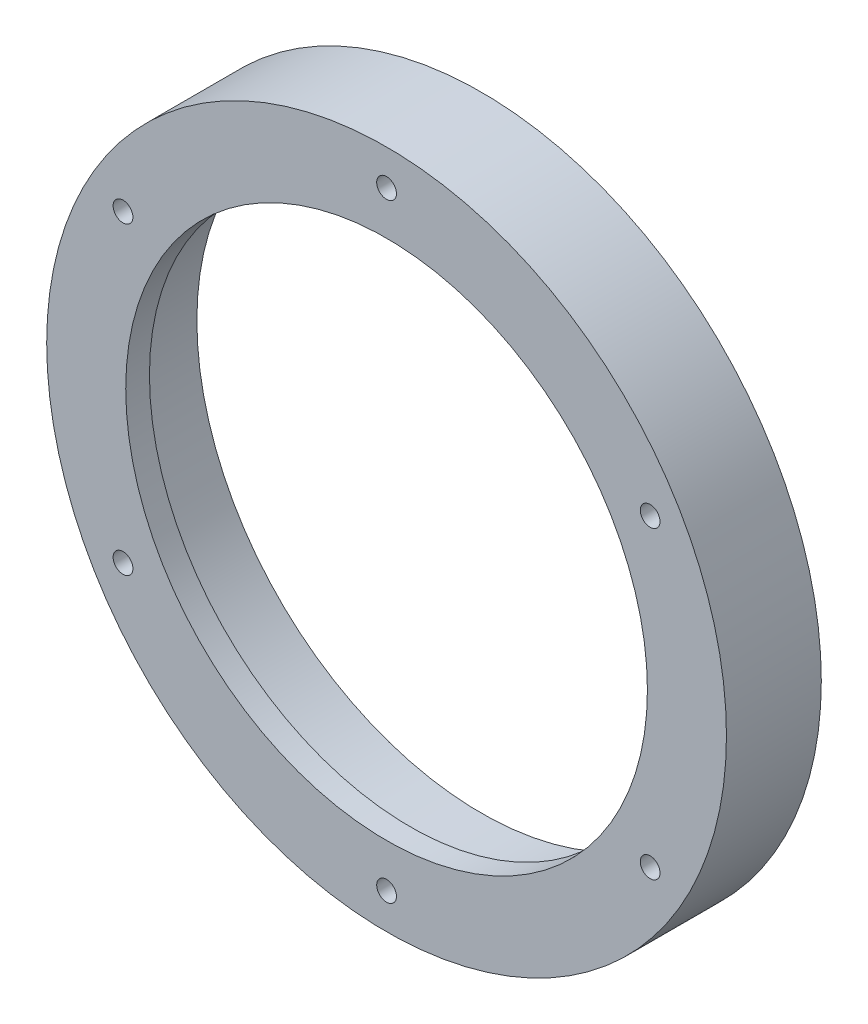
ISO-10303-21;
HEADER;
FILE_DESCRIPTION(('STEP AP214'),'2;1');
FILE_NAME('part.step','',(''),(''),'','','');
FILE_SCHEMA(('AUTOMOTIVE_DESIGN { 1 0 10303 214 1 1 1 1 }'));
ENDSEC;
DATA;
#1=APPLICATION_CONTEXT('core data for automotive mechanical design processes');
#2=APPLICATION_PROTOCOL_DEFINITION('international standard','automotive_design',2000,#1);
#3=PRODUCT_CONTEXT('',#1,'mechanical');
#4=PRODUCT('Part','Part','',(#3));
#5=PRODUCT_RELATED_PRODUCT_CATEGORY('part','',(#4));
#6=PRODUCT_DEFINITION_FORMATION('','',#4);
#7=PRODUCT_DEFINITION_CONTEXT('part definition',#1,'design');
#8=PRODUCT_DEFINITION('design','',#6,#7);
#9=PRODUCT_DEFINITION_SHAPE('','',#8);
#10=(LENGTH_UNIT() NAMED_UNIT(*) SI_UNIT(.MILLI.,.METRE.));
#11=(NAMED_UNIT(*) PLANE_ANGLE_UNIT() SI_UNIT($,.RADIAN.));
#12=(NAMED_UNIT(*) SI_UNIT($,.STERADIAN.) SOLID_ANGLE_UNIT());
#13=UNCERTAINTY_MEASURE_WITH_UNIT(LENGTH_MEASURE(1.E-05),#10,'distance_accuracy_value','');
#14=(GEOMETRIC_REPRESENTATION_CONTEXT(3) GLOBAL_UNCERTAINTY_ASSIGNED_CONTEXT((#13)) GLOBAL_UNIT_ASSIGNED_CONTEXT((#10,
#11,#12)) REPRESENTATION_CONTEXT('',''));
#15=CARTESIAN_POINT('',(0.,0.,0.));
#16=DIRECTION('',(0.,0.,1.));
#17=DIRECTION('',(1.,0.,0.));
#18=AXIS2_PLACEMENT_3D('',#15,#16,#17);
#19=CARTESIAN_POINT('',(0.,0.,0.));
#20=DIRECTION('',(0.,0.,1.));
#21=DIRECTION('',(1.,0.,0.));
#22=AXIS2_PLACEMENT_3D('',#19,#20,#21);
#23=PLANE('',#22);
#24=CARTESIAN_POINT('',(-33.3419780457009,19.25,0.));
#25=DIRECTION('',(0.,0.,-1.));
#26=DIRECTION('',(-1.,0.,0.));
#27=AXIS2_PLACEMENT_3D('',#24,#25,#26);
#28=CIRCLE('',#27,1.24999999999999);
#29=CARTESIAN_POINT('',(-34.5919780457009,19.25,0.));
#30=VERTEX_POINT('',#29);
#31=EDGE_CURVE('E97',#30,#30,#28,.T.);
#32=ORIENTED_EDGE('',*,*,#31,.F.);
#33=EDGE_LOOP('',(#32));
#34=FACE_BOUND('',#33,.T.);
#35=CARTESIAN_POINT('',(0.,38.5,0.));
#36=DIRECTION('',(0.,0.,-1.));
#37=DIRECTION('',(-1.,0.,0.));
#38=AXIS2_PLACEMENT_3D('',#35,#36,#37);
#39=CIRCLE('',#38,1.25);
#40=CARTESIAN_POINT('',(-1.25,38.5,0.));
#41=VERTEX_POINT('',#40);
#42=EDGE_CURVE('E91',#41,#41,#39,.T.);
#43=ORIENTED_EDGE('',*,*,#42,.F.);
#44=EDGE_LOOP('',(#43));
#45=FACE_BOUND('',#44,.T.);
#46=CARTESIAN_POINT('',(33.3419780457009,19.25,0.));
#47=DIRECTION('',(0.,0.,-1.));
#48=DIRECTION('',(-1.,0.,0.));
#49=AXIS2_PLACEMENT_3D('',#46,#47,#48);
#50=CIRCLE('',#49,1.24999999999999);
#51=CARTESIAN_POINT('',(32.0919780457009,19.25,0.));
#52=VERTEX_POINT('',#51);
#53=EDGE_CURVE('E85',#52,#52,#50,.T.);
#54=ORIENTED_EDGE('',*,*,#53,.F.);
#55=EDGE_LOOP('',(#54));
#56=FACE_BOUND('',#55,.T.);
#57=CARTESIAN_POINT('',(33.3419780457009,-19.25,0.));
#58=DIRECTION('',(0.,0.,-1.));
#59=DIRECTION('',(-1.,0.,0.));
#60=AXIS2_PLACEMENT_3D('',#57,#58,#59);
#61=CIRCLE('',#60,1.24999999999999);
#62=CARTESIAN_POINT('',(32.0919780457009,-19.25,0.));
#63=VERTEX_POINT('',#62);
#64=EDGE_CURVE('E79',#63,#63,#61,.T.);
#65=ORIENTED_EDGE('',*,*,#64,.F.);
#66=EDGE_LOOP('',(#65));
#67=FACE_BOUND('',#66,.T.);
#68=CARTESIAN_POINT('',(0.,-38.5,0.));
#69=DIRECTION('',(0.,0.,-1.));
#70=DIRECTION('',(-1.,0.,0.));
#71=AXIS2_PLACEMENT_3D('',#68,#69,#70);
#72=CIRCLE('',#71,1.25);
#73=CARTESIAN_POINT('',(-1.25,-38.5,0.));
#74=VERTEX_POINT('',#73);
#75=EDGE_CURVE('E73',#74,#74,#72,.T.);
#76=ORIENTED_EDGE('',*,*,#75,.F.);
#77=EDGE_LOOP('',(#76));
#78=FACE_BOUND('',#77,.T.);
#79=CARTESIAN_POINT('',(-33.3419780457009,-19.25,0.));
#80=DIRECTION('',(0.,0.,-1.));
#81=DIRECTION('',(-1.,0.,0.));
#82=AXIS2_PLACEMENT_3D('',#79,#80,#81);
#83=CIRCLE('',#82,1.24999999999999);
#84=CARTESIAN_POINT('',(-34.5919780457009,-19.25,0.));
#85=VERTEX_POINT('',#84);
#86=EDGE_CURVE('E67',#85,#85,#83,.T.);
#87=ORIENTED_EDGE('',*,*,#86,.F.);
#88=EDGE_LOOP('',(#87));
#89=FACE_BOUND('',#88,.T.);
#90=CARTESIAN_POINT('',(0.,0.,0.));
#91=DIRECTION('',(0.,0.,1.));
#92=DIRECTION('',(1.,0.,0.));
#93=AXIS2_PLACEMENT_3D('',#90,#91,#92);
#94=CIRCLE('',#93,43.);
#95=CARTESIAN_POINT('',(43.,0.,0.));
#96=VERTEX_POINT('',#95);
#97=EDGE_CURVE('E10',#96,#96,#94,.T.);
#98=ORIENTED_EDGE('',*,*,#97,.F.);
#99=EDGE_LOOP('',(#98));
#100=FACE_BOUND('',#99,.T.);
#101=CARTESIAN_POINT('',(0.,0.,0.));
#102=DIRECTION('',(0.,0.,1.));
#103=DIRECTION('',(1.,0.,0.));
#104=AXIS2_PLACEMENT_3D('',#101,#102,#103);
#105=CIRCLE('',#104,36.);
#106=CARTESIAN_POINT('',(36.,0.,0.));
#107=VERTEX_POINT('',#106);
#108=EDGE_CURVE('E45',#107,#107,#105,.T.);
#109=ORIENTED_EDGE('',*,*,#108,.T.);
#110=EDGE_LOOP('',(#109));
#111=FACE_BOUND('',#110,.T.);
#112=ADVANCED_FACE('F38',(#34,#45,#56,#67,#78,#89,#100,#111),#23,.F.);
#113=CARTESIAN_POINT('',(0.,0.,9.));
#114=DIRECTION('',(0.,0.,-1.));
#115=DIRECTION('',(-1.,0.,0.));
#116=AXIS2_PLACEMENT_3D('',#113,#114,#115);
#117=CYLINDRICAL_SURFACE('',#116,43.);
#118=ORIENTED_EDGE('',*,*,#97,.T.);
#119=EDGE_LOOP('',(#118));
#120=FACE_BOUND('',#119,.T.);
#121=CARTESIAN_POINT('',(0.,0.,12.));
#122=DIRECTION('',(0.,0.,1.));
#123=DIRECTION('',(1.,0.,0.));
#124=AXIS2_PLACEMENT_3D('',#121,#122,#123);
#125=CIRCLE('',#124,43.);
#126=CARTESIAN_POINT('',(43.,0.,12.));
#127=VERTEX_POINT('',#126);
#128=EDGE_CURVE('E53',#127,#127,#125,.T.);
#129=ORIENTED_EDGE('',*,*,#128,.F.);
#130=EDGE_LOOP('',(#129));
#131=FACE_BOUND('',#130,.T.);
#132=ADVANCED_FACE('F40',(#120,#131),#117,.T.);
#133=CARTESIAN_POINT('',(0.,0.,9.));
#134=DIRECTION('',(0.,0.,-1.));
#135=DIRECTION('',(-1.,0.,0.));
#136=AXIS2_PLACEMENT_3D('',#133,#134,#135);
#137=CYLINDRICAL_SURFACE('',#136,36.);
#138=CARTESIAN_POINT('',(0.,0.,9.));
#139=DIRECTION('',(0.,0.,1.));
#140=DIRECTION('',(1.,0.,0.));
#141=AXIS2_PLACEMENT_3D('',#138,#139,#140);
#142=CIRCLE('',#141,36.);
#143=CARTESIAN_POINT('',(36.,0.,9.));
#144=VERTEX_POINT('',#143);
#145=EDGE_CURVE('E49',#144,#144,#142,.T.);
#146=ORIENTED_EDGE('',*,*,#145,.T.);
#147=EDGE_LOOP('',(#146));
#148=FACE_BOUND('',#147,.T.);
#149=ORIENTED_EDGE('',*,*,#108,.F.);
#150=EDGE_LOOP('',(#149));
#151=FACE_BOUND('',#150,.T.);
#152=ADVANCED_FACE('F141',(#148,#151),#137,.F.);
#153=CARTESIAN_POINT('',(0.,0.,9.));
#154=DIRECTION('',(0.,0.,1.));
#155=DIRECTION('',(1.,0.,0.));
#156=AXIS2_PLACEMENT_3D('',#153,#154,#155);
#157=PLANE('',#156);
#158=CARTESIAN_POINT('',(0.,0.,9.));
#159=DIRECTION('',(0.,0.,1.));
#160=DIRECTION('',(1.,0.,0.));
#161=AXIS2_PLACEMENT_3D('',#158,#159,#160);
#162=CIRCLE('',#161,33.);
#163=CARTESIAN_POINT('',(33.,0.,9.));
#164=VERTEX_POINT('',#163);
#165=EDGE_CURVE('E59',#164,#164,#162,.T.);
#166=ORIENTED_EDGE('',*,*,#165,.T.);
#167=EDGE_LOOP('',(#166));
#168=FACE_BOUND('',#167,.T.);
#169=ORIENTED_EDGE('',*,*,#145,.F.);
#170=EDGE_LOOP('',(#169));
#171=FACE_BOUND('',#170,.T.);
#172=ADVANCED_FACE('F137',(#168,#171),#157,.F.);
#173=CARTESIAN_POINT('',(0.,0.,12.));
#174=DIRECTION('',(0.,0.,1.));
#175=DIRECTION('',(1.,0.,0.));
#176=AXIS2_PLACEMENT_3D('',#173,#174,#175);
#177=PLANE('',#176);
#178=CARTESIAN_POINT('',(-33.3419780457009,19.25,12.));
#179=DIRECTION('',(0.,0.,-1.));
#180=DIRECTION('',(-1.,0.,0.));
#181=AXIS2_PLACEMENT_3D('',#178,#179,#180);
#182=CIRCLE('',#181,1.24999999999999);
#183=CARTESIAN_POINT('',(-34.5919780457009,19.25,12.));
#184=VERTEX_POINT('',#183);
#185=EDGE_CURVE('E94',#184,#184,#182,.T.);
#186=ORIENTED_EDGE('',*,*,#185,.T.);
#187=EDGE_LOOP('',(#186));
#188=FACE_BOUND('',#187,.T.);
#189=CARTESIAN_POINT('',(0.,38.5,12.));
#190=DIRECTION('',(0.,0.,-1.));
#191=DIRECTION('',(-1.,0.,0.));
#192=AXIS2_PLACEMENT_3D('',#189,#190,#191);
#193=CIRCLE('',#192,1.24999999999999);
#194=CARTESIAN_POINT('',(-1.24999999999999,38.5,12.));
#195=VERTEX_POINT('',#194);
#196=EDGE_CURVE('E88',#195,#195,#193,.T.);
#197=ORIENTED_EDGE('',*,*,#196,.T.);
#198=EDGE_LOOP('',(#197));
#199=FACE_BOUND('',#198,.T.);
#200=CARTESIAN_POINT('',(33.3419780457009,19.25,12.));
#201=DIRECTION('',(0.,0.,-1.));
#202=DIRECTION('',(-1.,0.,0.));
#203=AXIS2_PLACEMENT_3D('',#200,#201,#202);
#204=CIRCLE('',#203,1.24999999999999);
#205=CARTESIAN_POINT('',(32.0919780457009,19.25,12.));
#206=VERTEX_POINT('',#205);
#207=EDGE_CURVE('E82',#206,#206,#204,.T.);
#208=ORIENTED_EDGE('',*,*,#207,.T.);
#209=EDGE_LOOP('',(#208));
#210=FACE_BOUND('',#209,.T.);
#211=CARTESIAN_POINT('',(33.3419780457009,-19.25,12.));
#212=DIRECTION('',(0.,0.,-1.));
#213=DIRECTION('',(-1.,0.,0.));
#214=AXIS2_PLACEMENT_3D('',#211,#212,#213);
#215=CIRCLE('',#214,1.24999999999999);
#216=CARTESIAN_POINT('',(32.0919780457009,-19.25,12.));
#217=VERTEX_POINT('',#216);
#218=EDGE_CURVE('E76',#217,#217,#215,.T.);
#219=ORIENTED_EDGE('',*,*,#218,.T.);
#220=EDGE_LOOP('',(#219));
#221=FACE_BOUND('',#220,.T.);
#222=CARTESIAN_POINT('',(0.,-38.5,12.));
#223=DIRECTION('',(0.,0.,-1.));
#224=DIRECTION('',(-1.,0.,0.));
#225=AXIS2_PLACEMENT_3D('',#222,#223,#224);
#226=CIRCLE('',#225,1.24999999999999);
#227=CARTESIAN_POINT('',(-1.25,-38.5,12.));
#228=VERTEX_POINT('',#227);
#229=EDGE_CURVE('E70',#228,#228,#226,.T.);
#230=ORIENTED_EDGE('',*,*,#229,.T.);
#231=EDGE_LOOP('',(#230));
#232=FACE_BOUND('',#231,.T.);
#233=CARTESIAN_POINT('',(-33.3419780457009,-19.25,12.));
#234=DIRECTION('',(0.,0.,-1.));
#235=DIRECTION('',(-1.,0.,0.));
#236=AXIS2_PLACEMENT_3D('',#233,#234,#235);
#237=CIRCLE('',#236,1.24999999999999);
#238=CARTESIAN_POINT('',(-34.5919780457009,-19.25,12.));
#239=VERTEX_POINT('',#238);
#240=EDGE_CURVE('E62',#239,#239,#237,.T.);
#241=ORIENTED_EDGE('',*,*,#240,.T.);
#242=EDGE_LOOP('',(#241));
#243=FACE_BOUND('',#242,.T.);
#244=ORIENTED_EDGE('',*,*,#128,.T.);
#245=EDGE_LOOP('',(#244));
#246=FACE_BOUND('',#245,.T.);
#247=CARTESIAN_POINT('',(0.,0.,12.));
#248=DIRECTION('',(0.,0.,1.));
#249=DIRECTION('',(1.,0.,0.));
#250=AXIS2_PLACEMENT_3D('',#247,#248,#249);
#251=CIRCLE('',#250,33.);
#252=CARTESIAN_POINT('',(33.,0.,12.));
#253=VERTEX_POINT('',#252);
#254=EDGE_CURVE('E58',#253,#253,#251,.T.);
#255=ORIENTED_EDGE('',*,*,#254,.F.);
#256=EDGE_LOOP('',(#255));
#257=FACE_BOUND('',#256,.T.);
#258=ADVANCED_FACE('F129',(#188,#199,#210,#221,#232,#243,#246,#257),#177,.T.);
#259=CARTESIAN_POINT('',(0.,0.,12.));
#260=DIRECTION('',(0.,0.,-1.));
#261=DIRECTION('',(-1.,0.,0.));
#262=AXIS2_PLACEMENT_3D('',#259,#260,#261);
#263=CYLINDRICAL_SURFACE('',#262,33.);
#264=ORIENTED_EDGE('',*,*,#254,.T.);
#265=EDGE_LOOP('',(#264));
#266=FACE_BOUND('',#265,.T.);
#267=ORIENTED_EDGE('',*,*,#165,.F.);
#268=EDGE_LOOP('',(#267));
#269=FACE_BOUND('',#268,.T.);
#270=ADVANCED_FACE('F119',(#266,#269),#263,.F.);
#271=CARTESIAN_POINT('',(-33.3419780457009,-19.25,0.));
#272=DIRECTION('',(0.,0.,-1.));
#273=DIRECTION('',(-1.,0.,0.));
#274=AXIS2_PLACEMENT_3D('',#271,#272,#273);
#275=CYLINDRICAL_SURFACE('',#274,1.24999999999999);
#276=ORIENTED_EDGE('',*,*,#240,.F.);
#277=EDGE_LOOP('',(#276));
#278=FACE_BOUND('',#277,.T.);
#279=ORIENTED_EDGE('',*,*,#86,.T.);
#280=EDGE_LOOP('',(#279));
#281=FACE_BOUND('',#280,.T.);
#282=ADVANCED_FACE('F116',(#278,#281),#275,.F.);
#283=CARTESIAN_POINT('',(0.,-38.5,0.));
#284=DIRECTION('',(0.,0.,-1.));
#285=DIRECTION('',(-1.,0.,0.));
#286=AXIS2_PLACEMENT_3D('',#283,#284,#285);
#287=CYLINDRICAL_SURFACE('',#286,1.25);
#288=ORIENTED_EDGE('',*,*,#229,.F.);
#289=EDGE_LOOP('',(#288));
#290=FACE_BOUND('',#289,.T.);
#291=ORIENTED_EDGE('',*,*,#75,.T.);
#292=EDGE_LOOP('',(#291));
#293=FACE_BOUND('',#292,.T.);
#294=ADVANCED_FACE('F118',(#290,#293),#287,.F.);
#295=CARTESIAN_POINT('',(33.3419780457009,-19.25,0.));
#296=DIRECTION('',(0.,0.,-1.));
#297=DIRECTION('',(-1.,0.,0.));
#298=AXIS2_PLACEMENT_3D('',#295,#296,#297);
#299=CYLINDRICAL_SURFACE('',#298,1.24999999999999);
#300=ORIENTED_EDGE('',*,*,#218,.F.);
#301=EDGE_LOOP('',(#300));
#302=FACE_BOUND('',#301,.T.);
#303=ORIENTED_EDGE('',*,*,#64,.T.);
#304=EDGE_LOOP('',(#303));
#305=FACE_BOUND('',#304,.T.);
#306=ADVANCED_FACE('F126',(#302,#305),#299,.F.);
#307=CARTESIAN_POINT('',(33.3419780457009,19.25,0.));
#308=DIRECTION('',(0.,0.,-1.));
#309=DIRECTION('',(-1.,0.,0.));
#310=AXIS2_PLACEMENT_3D('',#307,#308,#309);
#311=CYLINDRICAL_SURFACE('',#310,1.24999999999999);
#312=ORIENTED_EDGE('',*,*,#207,.F.);
#313=EDGE_LOOP('',(#312));
#314=FACE_BOUND('',#313,.T.);
#315=ORIENTED_EDGE('',*,*,#53,.T.);
#316=EDGE_LOOP('',(#315));
#317=FACE_BOUND('',#316,.T.);
#318=ADVANCED_FACE('F184',(#314,#317),#311,.F.);
#319=CARTESIAN_POINT('',(0.,38.5,0.));
#320=DIRECTION('',(0.,0.,-1.));
#321=DIRECTION('',(-1.,0.,0.));
#322=AXIS2_PLACEMENT_3D('',#319,#320,#321);
#323=CYLINDRICAL_SURFACE('',#322,1.25);
#324=ORIENTED_EDGE('',*,*,#196,.F.);
#325=EDGE_LOOP('',(#324));
#326=FACE_BOUND('',#325,.T.);
#327=ORIENTED_EDGE('',*,*,#42,.T.);
#328=EDGE_LOOP('',(#327));
#329=FACE_BOUND('',#328,.T.);
#330=ADVANCED_FACE('F174',(#326,#329),#323,.F.);
#331=CARTESIAN_POINT('',(-33.3419780457009,19.25,0.));
#332=DIRECTION('',(0.,0.,-1.));
#333=DIRECTION('',(-1.,0.,0.));
#334=AXIS2_PLACEMENT_3D('',#331,#332,#333);
#335=CYLINDRICAL_SURFACE('',#334,1.24999999999999);
#336=ORIENTED_EDGE('',*,*,#185,.F.);
#337=EDGE_LOOP('',(#336));
#338=FACE_BOUND('',#337,.T.);
#339=ORIENTED_EDGE('',*,*,#31,.T.);
#340=EDGE_LOOP('',(#339));
#341=FACE_BOUND('',#340,.T.);
#342=ADVANCED_FACE('F101',(#338,#341),#335,.F.);
#343=CLOSED_SHELL('',(#112,#132,#152,#172,#258,#270,#282,#294,#306,#318,#330,#342));
#344=MANIFOLD_SOLID_BREP('B2',#343);
#345=ADVANCED_BREP_SHAPE_REPRESENTATION('',(#18,#344),#14);
#346=SHAPE_DEFINITION_REPRESENTATION(#9,#345);
ENDSEC;
END-ISO-10303-21;
